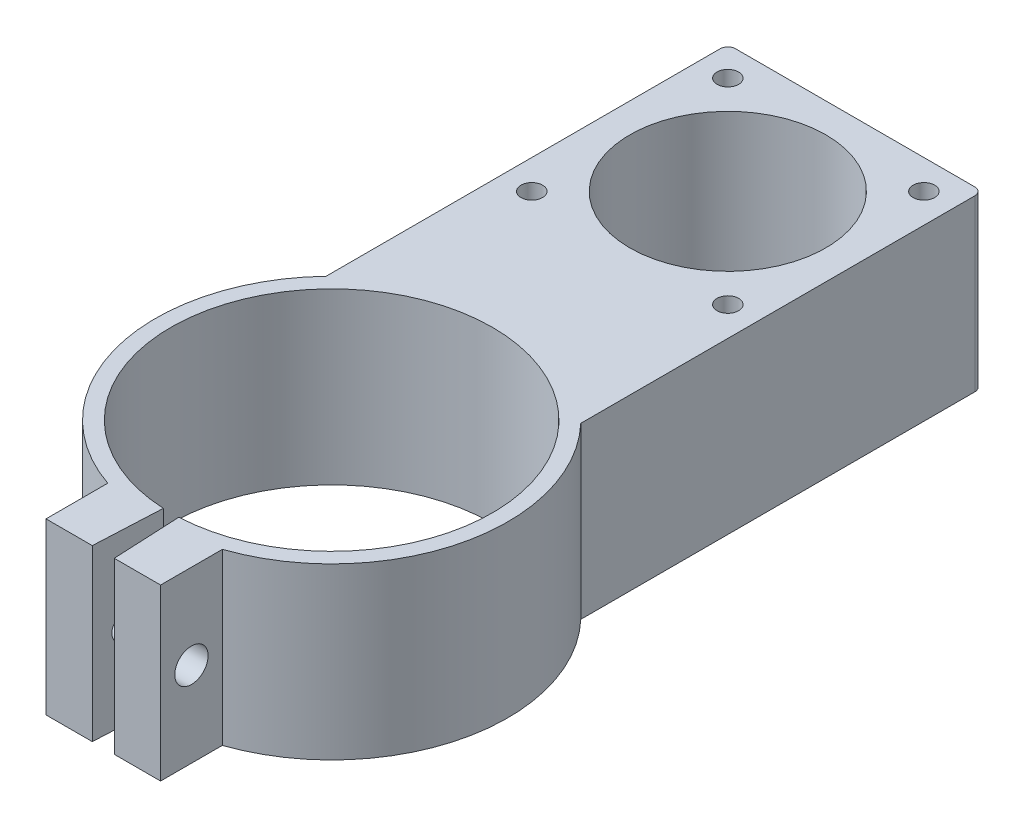
ISO-10303-21;
HEADER;
FILE_DESCRIPTION(('STEP AP214'),'2;1');
FILE_NAME('part.step','',(''),(''),'','','');
FILE_SCHEMA(('AUTOMOTIVE_DESIGN { 1 0 10303 214 1 1 1 1 }'));
ENDSEC;
DATA;
#1=APPLICATION_CONTEXT('core data for automotive mechanical design processes');
#2=APPLICATION_PROTOCOL_DEFINITION('international standard','automotive_design',2000,#1);
#3=PRODUCT_CONTEXT('',#1,'mechanical');
#4=PRODUCT('Part','Part','',(#3));
#5=PRODUCT_RELATED_PRODUCT_CATEGORY('part','',(#4));
#6=PRODUCT_DEFINITION_FORMATION('','',#4);
#7=PRODUCT_DEFINITION_CONTEXT('part definition',#1,'design');
#8=PRODUCT_DEFINITION('design','',#6,#7);
#9=PRODUCT_DEFINITION_SHAPE('','',#8);
#10=(LENGTH_UNIT() NAMED_UNIT(*) SI_UNIT(.MILLI.,.METRE.));
#11=(NAMED_UNIT(*) PLANE_ANGLE_UNIT() SI_UNIT($,.RADIAN.));
#12=(NAMED_UNIT(*) SI_UNIT($,.STERADIAN.) SOLID_ANGLE_UNIT());
#13=UNCERTAINTY_MEASURE_WITH_UNIT(LENGTH_MEASURE(1.E-05),#10,'distance_accuracy_value','');
#14=(GEOMETRIC_REPRESENTATION_CONTEXT(3) GLOBAL_UNCERTAINTY_ASSIGNED_CONTEXT((#13)) GLOBAL_UNIT_ASSIGNED_CONTEXT((#10,
#11,#12)) REPRESENTATION_CONTEXT('',''));
#15=CARTESIAN_POINT('',(0.,0.,0.));
#16=DIRECTION('',(0.,0.,1.));
#17=DIRECTION('',(1.,0.,0.));
#18=AXIS2_PLACEMENT_3D('',#15,#16,#17);
#19=CARTESIAN_POINT('',(0.,22.,0.));
#20=DIRECTION('',(0.,-1.,0.));
#21=DIRECTION('',(0.,0.,-1.));
#22=AXIS2_PLACEMENT_3D('',#19,#20,#21);
#23=CYLINDRICAL_SURFACE('',#22,20.828);
#24=CARTESIAN_POINT('',(0.,0.,0.));
#25=DIRECTION('',(0.,-1.,0.));
#26=DIRECTION('',(0.,0.,1.));
#27=AXIS2_PLACEMENT_3D('',#24,#25,#26);
#28=CIRCLE('',#27,20.828);
#29=CARTESIAN_POINT('',(-0.999999999999987,0.,20.8039800038358));
#30=VERTEX_POINT('',#29);
#31=CARTESIAN_POINT('',(1.,0.,20.8039800038358));
#32=VERTEX_POINT('',#31);
#33=EDGE_CURVE('E243',#30,#32,#28,.T.);
#34=ORIENTED_EDGE('',*,*,#33,.T.);
#35=DIRECTION('',(0.,-1.,0.));
#36=VECTOR('',#35,1.);
#37=CARTESIAN_POINT('',(1.,22.,20.8039800038358));
#38=LINE('',#37,#36);
#39=CARTESIAN_POINT('',(1.,22.,20.8039800038358));
#40=VERTEX_POINT('',#39);
#41=EDGE_CURVE('E321',#40,#32,#38,.T.);
#42=ORIENTED_EDGE('',*,*,#41,.F.);
#43=CARTESIAN_POINT('',(0.,22.,0.));
#44=DIRECTION('',(0.,-1.,0.));
#45=DIRECTION('',(0.,0.,1.));
#46=AXIS2_PLACEMENT_3D('',#43,#44,#45);
#47=CIRCLE('',#46,20.828);
#48=CARTESIAN_POINT('',(-0.999999999999987,22.,20.8039800038358));
#49=VERTEX_POINT('',#48);
#50=EDGE_CURVE('E244',#49,#40,#47,.T.);
#51=ORIENTED_EDGE('',*,*,#50,.F.);
#52=DIRECTION('',(0.,-1.,0.));
#53=VECTOR('',#52,1.);
#54=CARTESIAN_POINT('',(-0.999999999999987,22.,20.8039800038358));
#55=LINE('',#54,#53);
#56=EDGE_CURVE('E270',#49,#30,#55,.T.);
#57=ORIENTED_EDGE('',*,*,#56,.T.);
#58=EDGE_LOOP('',(#34,#42,#51,#57));
#59=FACE_BOUND('',#58,.T.);
#60=ADVANCED_FACE('F34',(#59),#23,.F.);
#61=CARTESIAN_POINT('',(1.,22.,20.8039800038358));
#62=DIRECTION('',(0.998846744950826,0.,-0.0480122911465339));
#63=DIRECTION('',(-0.0480122911465339,0.,-0.998846744950826));
#64=AXIS2_PLACEMENT_3D('',#61,#62,#63);
#65=PLANE('',#64);
#66=CARTESIAN_POINT('',(1.2299420361858,11.,25.5876895266864));
#67=DIRECTION('',(0.998846744950826,0.,-0.0480122911465339));
#68=DIRECTION('',(0.0480122911465339,0.,0.998846744950826));
#69=AXIS2_PLACEMENT_3D('',#66,#67,#68);
#70=ELLIPSE('',#69,2.16149275243049,2.159);
#71=CARTESIAN_POINT('',(1.33372025552661,11.,27.7466895266864));
#72=VERTEX_POINT('',#71);
#73=EDGE_CURVE('E232',#72,#72,#70,.F.);
#74=ORIENTED_EDGE('',*,*,#73,.F.);
#75=EDGE_LOOP('',(#74));
#76=FACE_BOUND('',#75,.T.);
#77=DIRECTION('',(0.0480122911465339,0.,0.998846744950826));
#78=VECTOR('',#77,1.);
#79=CARTESIAN_POINT('',(1.,0.,20.8039800038358));
#80=LINE('',#79,#78);
#81=CARTESIAN_POINT('',(1.42221293816044,0.,29.5876895266864));
#82=VERTEX_POINT('',#81);
#83=EDGE_CURVE('E273',#32,#82,#80,.T.);
#84=ORIENTED_EDGE('',*,*,#83,.T.);
#85=DIRECTION('',(0.,-1.,0.));
#86=VECTOR('',#85,1.);
#87=CARTESIAN_POINT('',(1.42221293816044,22.,29.5876895266864));
#88=LINE('',#87,#86);
#89=CARTESIAN_POINT('',(1.42221293816044,22.,29.5876895266864));
#90=VERTEX_POINT('',#89);
#91=EDGE_CURVE('E318',#90,#82,#88,.T.);
#92=ORIENTED_EDGE('',*,*,#91,.F.);
#93=DIRECTION('',(0.0480122911465339,0.,0.998846744950826));
#94=VECTOR('',#93,1.);
#95=CARTESIAN_POINT('',(1.,22.,20.8039800038358));
#96=LINE('',#95,#94);
#97=EDGE_CURVE('E247',#40,#90,#96,.T.);
#98=ORIENTED_EDGE('',*,*,#97,.F.);
#99=ORIENTED_EDGE('',*,*,#41,.T.);
#100=EDGE_LOOP('',(#84,#92,#98,#99));
#101=FACE_BOUND('',#100,.T.);
#102=ADVANCED_FACE('F365',(#76,#101),#65,.F.);
#103=CARTESIAN_POINT('',(1.42221293816044,22.,29.5876895266864));
#104=DIRECTION('',(0.,0.,-1.));
#105=DIRECTION('',(-1.,0.,0.));
#106=AXIS2_PLACEMENT_3D('',#103,#104,#105);
#107=PLANE('',#106);
#108=DIRECTION('',(1.,0.,0.));
#109=VECTOR('',#108,1.);
#110=CARTESIAN_POINT('',(1.42221293816044,0.,29.5876895266864));
#111=LINE('',#110,#109);
#112=CARTESIAN_POINT('',(7.42221293816044,0.,29.5876895266864));
#113=VERTEX_POINT('',#112);
#114=EDGE_CURVE('E275',#82,#113,#111,.T.);
#115=ORIENTED_EDGE('',*,*,#114,.T.);
#116=DIRECTION('',(0.,-1.,0.));
#117=VECTOR('',#116,1.);
#118=CARTESIAN_POINT('',(7.42221293816044,22.,29.5876895266864));
#119=LINE('',#118,#117);
#120=CARTESIAN_POINT('',(7.42221293816044,22.,29.5876895266864));
#121=VERTEX_POINT('',#120);
#122=EDGE_CURVE('E315',#121,#113,#119,.T.);
#123=ORIENTED_EDGE('',*,*,#122,.F.);
#124=DIRECTION('',(1.,0.,0.));
#125=VECTOR('',#124,1.);
#126=CARTESIAN_POINT('',(1.42221293816044,22.,29.5876895266864));
#127=LINE('',#126,#125);
#128=EDGE_CURVE('E250',#90,#121,#127,.T.);
#129=ORIENTED_EDGE('',*,*,#128,.F.);
#130=ORIENTED_EDGE('',*,*,#91,.T.);
#131=EDGE_LOOP('',(#115,#123,#129,#130));
#132=FACE_BOUND('',#131,.T.);
#133=ADVANCED_FACE('F362',(#132),#107,.F.);
#134=CARTESIAN_POINT('',(7.42221293816044,22.,29.5876895266864));
#135=DIRECTION('',(-1.,0.,0.));
#136=DIRECTION('',(0.,0.,1.));
#137=AXIS2_PLACEMENT_3D('',#134,#135,#136);
#138=PLANE('',#137);
#139=CARTESIAN_POINT('',(7.42221293816044,11.,25.5876895266864));
#140=DIRECTION('',(1.,0.,0.));
#141=DIRECTION('',(0.,0.,-1.));
#142=AXIS2_PLACEMENT_3D('',#139,#140,#141);
#143=CIRCLE('',#142,2.159);
#144=CARTESIAN_POINT('',(7.42221293816044,11.,23.4286895266863));
#145=VERTEX_POINT('',#144);
#146=EDGE_CURVE('E229',#145,#145,#143,.T.);
#147=ORIENTED_EDGE('',*,*,#146,.F.);
#148=EDGE_LOOP('',(#147));
#149=FACE_BOUND('',#148,.T.);
#150=DIRECTION('',(0.,0.,-1.));
#151=VECTOR('',#150,1.);
#152=CARTESIAN_POINT('',(7.42221293816044,0.,29.5876895266864));
#153=LINE('',#152,#151);
#154=CARTESIAN_POINT('',(7.42221293816044,0.,21.5876895266864));
#155=VERTEX_POINT('',#154);
#156=EDGE_CURVE('E277',#113,#155,#153,.T.);
#157=ORIENTED_EDGE('',*,*,#156,.T.);
#158=DIRECTION('',(0.,-1.,0.));
#159=VECTOR('',#158,1.);
#160=CARTESIAN_POINT('',(7.42221293816044,22.,21.5876895266864));
#161=LINE('',#160,#159);
#162=CARTESIAN_POINT('',(7.42221293816044,22.,21.5876895266864));
#163=VERTEX_POINT('',#162);
#164=EDGE_CURVE('E312',#163,#155,#161,.T.);
#165=ORIENTED_EDGE('',*,*,#164,.F.);
#166=DIRECTION('',(0.,0.,-1.));
#167=VECTOR('',#166,1.);
#168=CARTESIAN_POINT('',(7.42221293816044,22.,29.5876895266864));
#169=LINE('',#168,#167);
#170=EDGE_CURVE('E252',#121,#163,#169,.T.);
#171=ORIENTED_EDGE('',*,*,#170,.F.);
#172=ORIENTED_EDGE('',*,*,#122,.T.);
#173=EDGE_LOOP('',(#157,#165,#171,#172));
#174=FACE_BOUND('',#173,.T.);
#175=ADVANCED_FACE('F357',(#149,#174),#138,.F.);
#176=CARTESIAN_POINT('',(0.,22.,0.));
#177=DIRECTION('',(0.,-1.,0.));
#178=DIRECTION('',(0.,0.,-1.));
#179=AXIS2_PLACEMENT_3D('',#176,#177,#178);
#180=CYLINDRICAL_SURFACE('',#179,22.828);
#181=CARTESIAN_POINT('',(0.,0.,0.));
#182=DIRECTION('',(0.,1.,0.));
#183=DIRECTION('',(0.,0.,1.));
#184=AXIS2_PLACEMENT_3D('',#181,#182,#183);
#185=CIRCLE('',#184,22.828);
#186=CARTESIAN_POINT('',(16.5,0.,-15.775537518576));
#187=VERTEX_POINT('',#186);
#188=EDGE_CURVE('E279',#155,#187,#185,.T.);
#189=ORIENTED_EDGE('',*,*,#188,.T.);
#190=DIRECTION('',(0.,-1.,0.));
#191=VECTOR('',#190,1.);
#192=CARTESIAN_POINT('',(16.5,22.,-15.775537518576));
#193=LINE('',#192,#191);
#194=CARTESIAN_POINT('',(16.5,22.,-15.775537518576));
#195=VERTEX_POINT('',#194);
#196=EDGE_CURVE('E309',#195,#187,#193,.T.);
#197=ORIENTED_EDGE('',*,*,#196,.F.);
#198=CARTESIAN_POINT('',(0.,22.,0.));
#199=DIRECTION('',(0.,1.,0.));
#200=DIRECTION('',(0.,0.,1.));
#201=AXIS2_PLACEMENT_3D('',#198,#199,#200);
#202=CIRCLE('',#201,22.828);
#203=EDGE_CURVE('E254',#163,#195,#202,.T.);
#204=ORIENTED_EDGE('',*,*,#203,.F.);
#205=ORIENTED_EDGE('',*,*,#164,.T.);
#206=EDGE_LOOP('',(#189,#197,#204,#205));
#207=FACE_BOUND('',#206,.T.);
#208=ADVANCED_FACE('F352',(#207),#180,.T.);
#209=CARTESIAN_POINT('',(16.5,22.,-67.828));
#210=DIRECTION('',(-1.,0.,0.));
#211=DIRECTION('',(0.,0.,1.));
#212=AXIS2_PLACEMENT_3D('',#209,#210,#211);
#213=PLANE('',#212);
#214=DIRECTION('',(0.,0.,-1.));
#215=VECTOR('',#214,1.);
#216=CARTESIAN_POINT('',(16.5,0.,-67.828));
#217=LINE('',#216,#215);
#218=CARTESIAN_POINT('',(16.5,0.,-66.828));
#219=VERTEX_POINT('',#218);
#220=EDGE_CURVE('E281',#187,#219,#217,.T.);
#221=ORIENTED_EDGE('',*,*,#220,.T.);
#222=DIRECTION('',(0.,-1.,0.));
#223=VECTOR('',#222,1.);
#224=CARTESIAN_POINT('',(16.5,22.,-66.828));
#225=LINE('',#224,#223);
#226=CARTESIAN_POINT('',(16.5,22.,-66.828));
#227=VERTEX_POINT('',#226);
#228=EDGE_CURVE('E57',#219,#227,#225,.F.);
#229=ORIENTED_EDGE('',*,*,#228,.T.);
#230=DIRECTION('',(0.,0.,-1.));
#231=VECTOR('',#230,1.);
#232=CARTESIAN_POINT('',(16.5,22.,-67.828));
#233=LINE('',#232,#231);
#234=EDGE_CURVE('E256',#195,#227,#233,.T.);
#235=ORIENTED_EDGE('',*,*,#234,.F.);
#236=ORIENTED_EDGE('',*,*,#196,.T.);
#237=EDGE_LOOP('',(#221,#229,#235,#236));
#238=FACE_BOUND('',#237,.T.);
#239=ADVANCED_FACE('F348',(#238),#213,.F.);
#240=CARTESIAN_POINT('',(-16.5,22.,-67.828));
#241=DIRECTION('',(0.,0.,1.));
#242=DIRECTION('',(1.,0.,0.));
#243=AXIS2_PLACEMENT_3D('',#240,#241,#242);
#244=PLANE('',#243);
#245=DIRECTION('',(-1.,0.,0.));
#246=VECTOR('',#245,1.);
#247=CARTESIAN_POINT('',(-16.5,22.,-67.828));
#248=LINE('',#247,#246);
#249=CARTESIAN_POINT('',(15.5,22.,-67.828));
#250=VERTEX_POINT('',#249);
#251=CARTESIAN_POINT('',(-15.5,22.,-67.828));
#252=VERTEX_POINT('',#251);
#253=EDGE_CURVE('E258',#250,#252,#248,.T.);
#254=ORIENTED_EDGE('',*,*,#253,.F.);
#255=DIRECTION('',(0.,-1.,0.));
#256=VECTOR('',#255,1.);
#257=CARTESIAN_POINT('',(15.5,22.,-67.828));
#258=LINE('',#257,#256);
#259=CARTESIAN_POINT('',(15.5,0.,-67.828));
#260=VERTEX_POINT('',#259);
#261=EDGE_CURVE('E326',#250,#260,#258,.T.);
#262=ORIENTED_EDGE('',*,*,#261,.T.);
#263=DIRECTION('',(-1.,0.,0.));
#264=VECTOR('',#263,1.);
#265=CARTESIAN_POINT('',(-16.5,0.,-67.828));
#266=LINE('',#265,#264);
#267=CARTESIAN_POINT('',(-15.5,0.,-67.828));
#268=VERTEX_POINT('',#267);
#269=EDGE_CURVE('E283',#260,#268,#266,.T.);
#270=ORIENTED_EDGE('',*,*,#269,.T.);
#271=DIRECTION('',(0.,-1.,0.));
#272=VECTOR('',#271,1.);
#273=CARTESIAN_POINT('',(-15.5,22.,-67.828));
#274=LINE('',#273,#272);
#275=EDGE_CURVE('E324',#268,#252,#274,.F.);
#276=ORIENTED_EDGE('',*,*,#275,.T.);
#277=EDGE_LOOP('',(#254,#262,#270,#276));
#278=FACE_BOUND('',#277,.T.);
#279=ADVANCED_FACE('F340',(#278),#244,.F.);
#280=CARTESIAN_POINT('',(-16.5,22.,-67.828));
#281=DIRECTION('',(1.,0.,0.));
#282=DIRECTION('',(0.,0.,-1.));
#283=AXIS2_PLACEMENT_3D('',#280,#281,#282);
#284=PLANE('',#283);
#285=DIRECTION('',(0.,0.,1.));
#286=VECTOR('',#285,1.);
#287=CARTESIAN_POINT('',(-16.5,22.,-67.828));
#288=LINE('',#287,#286);
#289=CARTESIAN_POINT('',(-16.5,22.,-66.828));
#290=VERTEX_POINT('',#289);
#291=CARTESIAN_POINT('',(-16.5,22.,-15.775537518576));
#292=VERTEX_POINT('',#291);
#293=EDGE_CURVE('E260',#290,#292,#288,.T.);
#294=ORIENTED_EDGE('',*,*,#293,.F.);
#295=DIRECTION('',(0.,-1.,0.));
#296=VECTOR('',#295,1.);
#297=CARTESIAN_POINT('',(-16.5,22.,-66.828));
#298=LINE('',#297,#296);
#299=CARTESIAN_POINT('',(-16.5,0.,-66.828));
#300=VERTEX_POINT('',#299);
#301=EDGE_CURVE('E12',#290,#300,#298,.T.);
#302=ORIENTED_EDGE('',*,*,#301,.T.);
#303=DIRECTION('',(0.,0.,1.));
#304=VECTOR('',#303,1.);
#305=CARTESIAN_POINT('',(-16.5,0.,-67.828));
#306=LINE('',#305,#304);
#307=CARTESIAN_POINT('',(-16.5,0.,-15.775537518576));
#308=VERTEX_POINT('',#307);
#309=EDGE_CURVE('E286',#300,#308,#306,.T.);
#310=ORIENTED_EDGE('',*,*,#309,.T.);
#311=DIRECTION('',(0.,-1.,0.));
#312=VECTOR('',#311,1.);
#313=CARTESIAN_POINT('',(-16.5,22.,-15.775537518576));
#314=LINE('',#313,#312);
#315=EDGE_CURVE('E306',#292,#308,#314,.T.);
#316=ORIENTED_EDGE('',*,*,#315,.F.);
#317=EDGE_LOOP('',(#294,#302,#310,#316));
#318=FACE_BOUND('',#317,.T.);
#319=ADVANCED_FACE('F393',(#318),#284,.F.);
#320=CARTESIAN_POINT('',(0.,22.,0.));
#321=DIRECTION('',(0.,-1.,0.));
#322=DIRECTION('',(0.,0.,-1.));
#323=AXIS2_PLACEMENT_3D('',#320,#321,#322);
#324=CYLINDRICAL_SURFACE('',#323,22.828);
#325=CARTESIAN_POINT('',(0.,0.,0.));
#326=DIRECTION('',(0.,1.,0.));
#327=DIRECTION('',(0.,0.,1.));
#328=AXIS2_PLACEMENT_3D('',#325,#326,#327);
#329=CIRCLE('',#328,22.828);
#330=CARTESIAN_POINT('',(-7.42221293816044,0.,21.5876895266864));
#331=VERTEX_POINT('',#330);
#332=EDGE_CURVE('E288',#308,#331,#329,.T.);
#333=ORIENTED_EDGE('',*,*,#332,.T.);
#334=DIRECTION('',(0.,-1.,0.));
#335=VECTOR('',#334,1.);
#336=CARTESIAN_POINT('',(-7.42221293816044,22.,21.5876895266864));
#337=LINE('',#336,#335);
#338=CARTESIAN_POINT('',(-7.42221293816044,22.,21.5876895266864));
#339=VERTEX_POINT('',#338);
#340=EDGE_CURVE('E303',#339,#331,#337,.T.);
#341=ORIENTED_EDGE('',*,*,#340,.F.);
#342=CARTESIAN_POINT('',(0.,22.,0.));
#343=DIRECTION('',(0.,1.,0.));
#344=DIRECTION('',(0.,0.,1.));
#345=AXIS2_PLACEMENT_3D('',#342,#343,#344);
#346=CIRCLE('',#345,22.828);
#347=EDGE_CURVE('E262',#292,#339,#346,.T.);
#348=ORIENTED_EDGE('',*,*,#347,.F.);
#349=ORIENTED_EDGE('',*,*,#315,.T.);
#350=EDGE_LOOP('',(#333,#341,#348,#349));
#351=FACE_BOUND('',#350,.T.);
#352=ADVANCED_FACE('F390',(#351),#324,.T.);
#353=CARTESIAN_POINT('',(-7.42221293816043,22.,29.5876895266864));
#354=DIRECTION('',(1.,0.,0.));
#355=DIRECTION('',(0.,0.,-1.));
#356=AXIS2_PLACEMENT_3D('',#353,#354,#355);
#357=PLANE('',#356);
#358=CARTESIAN_POINT('',(-7.42221293816042,11.,25.5876895266864));
#359=DIRECTION('',(-1.,0.,0.));
#360=DIRECTION('',(0.,0.,1.));
#361=AXIS2_PLACEMENT_3D('',#358,#359,#360);
#362=CIRCLE('',#361,1.5875);
#363=CARTESIAN_POINT('',(-7.42221293816042,11.,27.1751895266864));
#364=VERTEX_POINT('',#363);
#365=EDGE_CURVE('E240',#364,#364,#362,.T.);
#366=ORIENTED_EDGE('',*,*,#365,.F.);
#367=EDGE_LOOP('',(#366));
#368=FACE_BOUND('',#367,.T.);
#369=DIRECTION('',(0.,0.,1.));
#370=VECTOR('',#369,1.);
#371=CARTESIAN_POINT('',(-7.42221293816043,0.,29.5876895266864));
#372=LINE('',#371,#370);
#373=CARTESIAN_POINT('',(-7.42221293816043,0.,29.5876895266864));
#374=VERTEX_POINT('',#373);
#375=EDGE_CURVE('E290',#331,#374,#372,.T.);
#376=ORIENTED_EDGE('',*,*,#375,.T.);
#377=DIRECTION('',(0.,-1.,0.));
#378=VECTOR('',#377,1.);
#379=CARTESIAN_POINT('',(-7.42221293816043,22.,29.5876895266864));
#380=LINE('',#379,#378);
#381=CARTESIAN_POINT('',(-7.42221293816043,22.,29.5876895266864));
#382=VERTEX_POINT('',#381);
#383=EDGE_CURVE('E300',#382,#374,#380,.T.);
#384=ORIENTED_EDGE('',*,*,#383,.F.);
#385=DIRECTION('',(0.,0.,1.));
#386=VECTOR('',#385,1.);
#387=CARTESIAN_POINT('',(-7.42221293816043,22.,29.5876895266864));
#388=LINE('',#387,#386);
#389=EDGE_CURVE('E264',#339,#382,#388,.T.);
#390=ORIENTED_EDGE('',*,*,#389,.F.);
#391=ORIENTED_EDGE('',*,*,#340,.T.);
#392=EDGE_LOOP('',(#376,#384,#390,#391));
#393=FACE_BOUND('',#392,.T.);
#394=ADVANCED_FACE('F385',(#368,#393),#357,.F.);
#395=CARTESIAN_POINT('',(-1.42221293816043,22.,29.5876895266864));
#396=DIRECTION('',(0.,0.,-1.));
#397=DIRECTION('',(-1.,0.,0.));
#398=AXIS2_PLACEMENT_3D('',#395,#396,#397);
#399=PLANE('',#398);
#400=DIRECTION('',(1.,0.,0.));
#401=VECTOR('',#400,1.);
#402=CARTESIAN_POINT('',(-1.42221293816043,0.,29.5876895266864));
#403=LINE('',#402,#401);
#404=CARTESIAN_POINT('',(-1.42221293816043,0.,29.5876895266864));
#405=VERTEX_POINT('',#404);
#406=EDGE_CURVE('E292',#374,#405,#403,.T.);
#407=ORIENTED_EDGE('',*,*,#406,.T.);
#408=DIRECTION('',(0.,-1.,0.));
#409=VECTOR('',#408,1.);
#410=CARTESIAN_POINT('',(-1.42221293816043,22.,29.5876895266864));
#411=LINE('',#410,#409);
#412=CARTESIAN_POINT('',(-1.42221293816043,22.,29.5876895266864));
#413=VERTEX_POINT('',#412);
#414=EDGE_CURVE('E297',#413,#405,#411,.T.);
#415=ORIENTED_EDGE('',*,*,#414,.F.);
#416=DIRECTION('',(1.,0.,0.));
#417=VECTOR('',#416,1.);
#418=CARTESIAN_POINT('',(-1.42221293816043,22.,29.5876895266864));
#419=LINE('',#418,#417);
#420=EDGE_CURVE('E266',#382,#413,#419,.T.);
#421=ORIENTED_EDGE('',*,*,#420,.F.);
#422=ORIENTED_EDGE('',*,*,#383,.T.);
#423=EDGE_LOOP('',(#407,#415,#421,#422));
#424=FACE_BOUND('',#423,.T.);
#425=ADVANCED_FACE('F379',(#424),#399,.F.);
#426=CARTESIAN_POINT('',(-0.999999999999987,22.,20.8039800038358));
#427=DIRECTION('',(-0.998846744950826,0.,-0.0480122911465337));
#428=DIRECTION('',(-0.0480122911465337,0.,0.998846744950826));
#429=AXIS2_PLACEMENT_3D('',#426,#427,#428);
#430=PLANE('',#429);
#431=CARTESIAN_POINT('',(-1.22994203618578,11.,25.5876895266864));
#432=DIRECTION('',(-0.998846744950826,0.,-0.0480122911465337));
#433=DIRECTION('',(-0.0480122911465337,0.,0.998846744950826));
#434=AXIS2_PLACEMENT_3D('',#431,#432,#433);
#435=ELLIPSE('',#434,1.58933290619889,1.5875);
#436=CARTESIAN_POINT('',(-1.30624955040697,11.,27.1751895266864));
#437=VERTEX_POINT('',#436);
#438=EDGE_CURVE('E235',#437,#437,#435,.F.);
#439=ORIENTED_EDGE('',*,*,#438,.F.);
#440=EDGE_LOOP('',(#439));
#441=FACE_BOUND('',#440,.T.);
#442=DIRECTION('',(0.0480122911465337,0.,-0.998846744950826));
#443=VECTOR('',#442,1.);
#444=CARTESIAN_POINT('',(-0.999999999999987,0.,20.8039800038358));
#445=LINE('',#444,#443);
#446=EDGE_CURVE('E248',#405,#30,#445,.T.);
#447=ORIENTED_EDGE('',*,*,#446,.T.);
#448=ORIENTED_EDGE('',*,*,#56,.F.);
#449=DIRECTION('',(0.0480122911465337,0.,-0.998846744950826));
#450=VECTOR('',#449,1.);
#451=CARTESIAN_POINT('',(-0.999999999999987,22.,20.8039800038358));
#452=LINE('',#451,#450);
#453=EDGE_CURVE('E268',#413,#49,#452,.T.);
#454=ORIENTED_EDGE('',*,*,#453,.F.);
#455=ORIENTED_EDGE('',*,*,#414,.T.);
#456=EDGE_LOOP('',(#447,#448,#454,#455));
#457=FACE_BOUND('',#456,.T.);
#458=ADVANCED_FACE('F375',(#441,#457),#430,.F.);
#459=CARTESIAN_POINT('',(0.,22.,0.));
#460=DIRECTION('',(0.,1.,0.));
#461=DIRECTION('',(0.,0.,1.));
#462=AXIS2_PLACEMENT_3D('',#459,#460,#461);
#463=PLANE('',#462);
#464=CARTESIAN_POINT('',(-12.6999999999999,22.,-64.0280000000001));
#465=DIRECTION('',(0.,1.,0.));
#466=DIRECTION('',(0.,0.,1.));
#467=AXIS2_PLACEMENT_3D('',#464,#465,#466);
#468=CIRCLE('',#467,1.397);
#469=CARTESIAN_POINT('',(-12.6999999999999,22.,-62.6310000000001));
#470=VERTEX_POINT('',#469);
#471=EDGE_CURVE('E201',#470,#470,#468,.T.);
#472=ORIENTED_EDGE('',*,*,#471,.F.);
#473=EDGE_LOOP('',(#472));
#474=FACE_BOUND('',#473,.T.);
#475=CARTESIAN_POINT('',(-12.7000000000001,22.,-38.6280000000001));
#476=DIRECTION('',(0.,1.,0.));
#477=DIRECTION('',(0.,0.,1.));
#478=AXIS2_PLACEMENT_3D('',#475,#476,#477);
#479=CIRCLE('',#478,1.397);
#480=CARTESIAN_POINT('',(-12.7000000000001,22.,-37.2310000000001));
#481=VERTEX_POINT('',#480);
#482=EDGE_CURVE('E212',#481,#481,#479,.T.);
#483=ORIENTED_EDGE('',*,*,#482,.F.);
#484=EDGE_LOOP('',(#483));
#485=FACE_BOUND('',#484,.T.);
#486=CARTESIAN_POINT('',(12.7,22.,-38.628));
#487=DIRECTION('',(0.,1.,0.));
#488=DIRECTION('',(0.,0.,1.));
#489=AXIS2_PLACEMENT_3D('',#486,#487,#488);
#490=CIRCLE('',#489,1.397);
#491=CARTESIAN_POINT('',(12.7,22.,-37.231));
#492=VERTEX_POINT('',#491);
#493=EDGE_CURVE('E206',#492,#492,#490,.T.);
#494=ORIENTED_EDGE('',*,*,#493,.F.);
#495=EDGE_LOOP('',(#494));
#496=FACE_BOUND('',#495,.T.);
#497=CARTESIAN_POINT('',(12.7,22.,-64.028));
#498=DIRECTION('',(0.,1.,0.));
#499=DIRECTION('',(0.,0.,1.));
#500=AXIS2_PLACEMENT_3D('',#497,#498,#499);
#501=CIRCLE('',#500,1.397);
#502=CARTESIAN_POINT('',(12.7,22.,-62.631));
#503=VERTEX_POINT('',#502);
#504=EDGE_CURVE('E205',#503,#503,#501,.T.);
#505=ORIENTED_EDGE('',*,*,#504,.F.);
#506=EDGE_LOOP('',(#505));
#507=FACE_BOUND('',#506,.T.);
#508=CARTESIAN_POINT('',(0.,22.,-51.328));
#509=DIRECTION('',(0.,-1.,0.));
#510=DIRECTION('',(0.,0.,-1.));
#511=AXIS2_PLACEMENT_3D('',#508,#509,#510);
#512=CIRCLE('',#511,12.7);
#513=CARTESIAN_POINT('',(0.,22.,-64.028));
#514=VERTEX_POINT('',#513);
#515=EDGE_CURVE('E226',#514,#514,#512,.T.);
#516=ORIENTED_EDGE('',*,*,#515,.T.);
#517=EDGE_LOOP('',(#516));
#518=FACE_BOUND('',#517,.T.);
#519=ORIENTED_EDGE('',*,*,#234,.T.);
#520=CARTESIAN_POINT('',(15.5,22.,-66.828));
#521=DIRECTION('',(0.,1.,0.));
#522=DIRECTION('',(0.,0.,1.));
#523=AXIS2_PLACEMENT_3D('',#520,#521,#522);
#524=CIRCLE('',#523,1.);
#525=EDGE_CURVE('E42',#227,#250,#524,.T.);
#526=ORIENTED_EDGE('',*,*,#525,.T.);
#527=ORIENTED_EDGE('',*,*,#253,.T.);
#528=CARTESIAN_POINT('',(-15.5,22.,-66.828));
#529=DIRECTION('',(0.,1.,0.));
#530=DIRECTION('',(0.,0.,1.));
#531=AXIS2_PLACEMENT_3D('',#528,#529,#530);
#532=CIRCLE('',#531,1.);
#533=EDGE_CURVE('E49',#252,#290,#532,.T.);
#534=ORIENTED_EDGE('',*,*,#533,.T.);
#535=ORIENTED_EDGE('',*,*,#293,.T.);
#536=ORIENTED_EDGE('',*,*,#347,.T.);
#537=ORIENTED_EDGE('',*,*,#389,.T.);
#538=ORIENTED_EDGE('',*,*,#420,.T.);
#539=ORIENTED_EDGE('',*,*,#453,.T.);
#540=ORIENTED_EDGE('',*,*,#50,.T.);
#541=ORIENTED_EDGE('',*,*,#97,.T.);
#542=ORIENTED_EDGE('',*,*,#128,.T.);
#543=ORIENTED_EDGE('',*,*,#170,.T.);
#544=ORIENTED_EDGE('',*,*,#203,.T.);
#545=EDGE_LOOP('',(#519,#526,#527,#534,#535,#536,#537,#538,#539,#540,#541,#542,#543,#544));
#546=FACE_BOUND('',#545,.T.);
#547=ADVANCED_FACE('F336',(#474,#485,#496,#507,#518,#546),#463,.T.);
#548=CARTESIAN_POINT('',(0.,0.,0.));
#549=DIRECTION('',(0.,1.,0.));
#550=DIRECTION('',(0.,0.,1.));
#551=AXIS2_PLACEMENT_3D('',#548,#549,#550);
#552=PLANE('',#551);
#553=DIRECTION('',(0.,0.,1.));
#554=VECTOR('',#553,1.);
#555=CARTESIAN_POINT('',(13.5,0.,-34.628));
#556=LINE('',#555,#554);
#557=CARTESIAN_POINT('',(13.5,0.,-34.628));
#558=VERTEX_POINT('',#557);
#559=CARTESIAN_POINT('',(13.5,0.,-19.6347544929902));
#560=VERTEX_POINT('',#559);
#561=EDGE_CURVE('E186',#558,#560,#556,.T.);
#562=ORIENTED_EDGE('',*,*,#561,.F.);
#563=DIRECTION('',(1.,0.,0.));
#564=VECTOR('',#563,1.);
#565=CARTESIAN_POINT('',(-13.5,0.,-34.628));
#566=LINE('',#565,#564);
#567=CARTESIAN_POINT('',(-13.5,0.,-34.628));
#568=VERTEX_POINT('',#567);
#569=EDGE_CURVE('E178',#568,#558,#566,.T.);
#570=ORIENTED_EDGE('',*,*,#569,.F.);
#571=DIRECTION('',(0.,0.,-1.));
#572=VECTOR('',#571,1.);
#573=CARTESIAN_POINT('',(-13.5,0.,-34.628));
#574=LINE('',#573,#572);
#575=CARTESIAN_POINT('',(-13.5,0.,-19.6347544929902));
#576=VERTEX_POINT('',#575);
#577=EDGE_CURVE('E190',#576,#568,#574,.T.);
#578=ORIENTED_EDGE('',*,*,#577,.F.);
#579=CARTESIAN_POINT('',(0.,0.,0.));
#580=DIRECTION('',(0.,1.,0.));
#581=DIRECTION('',(0.,0.,-1.));
#582=AXIS2_PLACEMENT_3D('',#579,#580,#581);
#583=CIRCLE('',#582,23.828);
#584=EDGE_CURVE('E184',#560,#576,#583,.T.);
#585=ORIENTED_EDGE('',*,*,#584,.F.);
#586=EDGE_LOOP('',(#562,#570,#578,#585));
#587=FACE_BOUND('',#586,.T.);
#588=CARTESIAN_POINT('',(-12.6999999999999,0.,-64.0280000000001));
#589=DIRECTION('',(0.,1.,0.));
#590=DIRECTION('',(0.,0.,1.));
#591=AXIS2_PLACEMENT_3D('',#588,#589,#590);
#592=CIRCLE('',#591,1.397);
#593=CARTESIAN_POINT('',(-12.6999999999999,0.,-62.6310000000001));
#594=VERTEX_POINT('',#593);
#595=EDGE_CURVE('E215',#594,#594,#592,.T.);
#596=ORIENTED_EDGE('',*,*,#595,.T.);
#597=EDGE_LOOP('',(#596));
#598=FACE_BOUND('',#597,.T.);
#599=CARTESIAN_POINT('',(-12.7000000000001,0.,-38.6280000000001));
#600=DIRECTION('',(0.,1.,0.));
#601=DIRECTION('',(0.,0.,1.));
#602=AXIS2_PLACEMENT_3D('',#599,#600,#601);
#603=CIRCLE('',#602,1.397);
#604=CARTESIAN_POINT('',(-12.7000000000001,0.,-37.2310000000001));
#605=VERTEX_POINT('',#604);
#606=EDGE_CURVE('E209',#605,#605,#603,.T.);
#607=ORIENTED_EDGE('',*,*,#606,.T.);
#608=EDGE_LOOP('',(#607));
#609=FACE_BOUND('',#608,.T.);
#610=CARTESIAN_POINT('',(12.7,0.,-38.628));
#611=DIRECTION('',(0.,1.,0.));
#612=DIRECTION('',(0.,0.,1.));
#613=AXIS2_PLACEMENT_3D('',#610,#611,#612);
#614=CIRCLE('',#613,1.397);
#615=CARTESIAN_POINT('',(12.7,0.,-37.231));
#616=VERTEX_POINT('',#615);
#617=EDGE_CURVE('E202',#616,#616,#614,.T.);
#618=ORIENTED_EDGE('',*,*,#617,.T.);
#619=EDGE_LOOP('',(#618));
#620=FACE_BOUND('',#619,.T.);
#621=CARTESIAN_POINT('',(12.7,0.,-64.028));
#622=DIRECTION('',(0.,1.,0.));
#623=DIRECTION('',(0.,0.,1.));
#624=AXIS2_PLACEMENT_3D('',#621,#622,#623);
#625=CIRCLE('',#624,1.397);
#626=CARTESIAN_POINT('',(12.7,0.,-62.631));
#627=VERTEX_POINT('',#626);
#628=EDGE_CURVE('E220',#627,#627,#625,.T.);
#629=ORIENTED_EDGE('',*,*,#628,.T.);
#630=EDGE_LOOP('',(#629));
#631=FACE_BOUND('',#630,.T.);
#632=CARTESIAN_POINT('',(0.,0.,-51.328));
#633=DIRECTION('',(0.,-1.,0.));
#634=DIRECTION('',(0.,0.,-1.));
#635=AXIS2_PLACEMENT_3D('',#632,#633,#634);
#636=CIRCLE('',#635,12.7);
#637=CARTESIAN_POINT('',(0.,0.,-64.028));
#638=VERTEX_POINT('',#637);
#639=EDGE_CURVE('E223',#638,#638,#636,.T.);
#640=ORIENTED_EDGE('',*,*,#639,.F.);
#641=EDGE_LOOP('',(#640));
#642=FACE_BOUND('',#641,.T.);
#643=ORIENTED_EDGE('',*,*,#269,.F.);
#644=CARTESIAN_POINT('',(15.5,0.,-66.828));
#645=DIRECTION('',(0.,1.,0.));
#646=DIRECTION('',(0.,0.,1.));
#647=AXIS2_PLACEMENT_3D('',#644,#645,#646);
#648=CIRCLE('',#647,1.);
#649=EDGE_CURVE('E331',#260,#219,#648,.F.);
#650=ORIENTED_EDGE('',*,*,#649,.T.);
#651=ORIENTED_EDGE('',*,*,#220,.F.);
#652=ORIENTED_EDGE('',*,*,#188,.F.);
#653=ORIENTED_EDGE('',*,*,#156,.F.);
#654=ORIENTED_EDGE('',*,*,#114,.F.);
#655=ORIENTED_EDGE('',*,*,#83,.F.);
#656=ORIENTED_EDGE('',*,*,#33,.F.);
#657=ORIENTED_EDGE('',*,*,#446,.F.);
#658=ORIENTED_EDGE('',*,*,#406,.F.);
#659=ORIENTED_EDGE('',*,*,#375,.F.);
#660=ORIENTED_EDGE('',*,*,#332,.F.);
#661=ORIENTED_EDGE('',*,*,#309,.F.);
#662=CARTESIAN_POINT('',(-15.5,0.,-66.828));
#663=DIRECTION('',(0.,1.,0.));
#664=DIRECTION('',(0.,0.,1.));
#665=AXIS2_PLACEMENT_3D('',#662,#663,#664);
#666=CIRCLE('',#665,1.);
#667=EDGE_CURVE('E329',#300,#268,#666,.F.);
#668=ORIENTED_EDGE('',*,*,#667,.T.);
#669=EDGE_LOOP('',(#643,#650,#651,#652,#653,#654,#655,#656,#657,#658,#659,#660,#661,#668));
#670=FACE_BOUND('',#669,.T.);
#671=ADVANCED_FACE('F346',(#587,#598,#609,#620,#631,#642,#670),#552,.F.);
#672=CARTESIAN_POINT('',(22.8290000000001,11.,25.5876895266863));
#673=DIRECTION('',(-1.,0.,0.));
#674=DIRECTION('',(0.,0.,1.));
#675=AXIS2_PLACEMENT_3D('',#672,#673,#674);
#676=CYLINDRICAL_SURFACE('',#675,1.5875);
#677=ORIENTED_EDGE('',*,*,#365,.T.);
#678=EDGE_LOOP('',(#677));
#679=FACE_BOUND('',#678,.T.);
#680=ORIENTED_EDGE('',*,*,#438,.T.);
#681=EDGE_LOOP('',(#680));
#682=FACE_BOUND('',#681,.T.);
#683=ADVANCED_FACE('F434',(#679,#682),#676,.F.);
#684=CARTESIAN_POINT('',(-22.829,11.,25.5876895266864));
#685=DIRECTION('',(1.,0.,0.));
#686=DIRECTION('',(0.,0.,-1.));
#687=AXIS2_PLACEMENT_3D('',#684,#685,#686);
#688=CYLINDRICAL_SURFACE('',#687,2.159);
#689=ORIENTED_EDGE('',*,*,#146,.T.);
#690=EDGE_LOOP('',(#689));
#691=FACE_BOUND('',#690,.T.);
#692=ORIENTED_EDGE('',*,*,#73,.T.);
#693=EDGE_LOOP('',(#692));
#694=FACE_BOUND('',#693,.T.);
#695=ADVANCED_FACE('F441',(#691,#694),#688,.F.);
#696=CARTESIAN_POINT('',(0.,22.,-51.328));
#697=DIRECTION('',(0.,-1.,0.));
#698=DIRECTION('',(0.,0.,-1.));
#699=AXIS2_PLACEMENT_3D('',#696,#697,#698);
#700=CYLINDRICAL_SURFACE('',#699,12.7);
#701=ORIENTED_EDGE('',*,*,#515,.F.);
#702=EDGE_LOOP('',(#701));
#703=FACE_BOUND('',#702,.T.);
#704=ORIENTED_EDGE('',*,*,#639,.T.);
#705=EDGE_LOOP('',(#704));
#706=FACE_BOUND('',#705,.T.);
#707=ADVANCED_FACE('F445',(#703,#706),#700,.F.);
#708=CARTESIAN_POINT('',(12.7,0.,-64.028));
#709=DIRECTION('',(0.,1.,0.));
#710=DIRECTION('',(0.,0.,1.));
#711=AXIS2_PLACEMENT_3D('',#708,#709,#710);
#712=CYLINDRICAL_SURFACE('',#711,1.397);
#713=ORIENTED_EDGE('',*,*,#628,.F.);
#714=EDGE_LOOP('',(#713));
#715=FACE_BOUND('',#714,.T.);
#716=ORIENTED_EDGE('',*,*,#504,.T.);
#717=EDGE_LOOP('',(#716));
#718=FACE_BOUND('',#717,.T.);
#719=ADVANCED_FACE('F449',(#715,#718),#712,.F.);
#720=CARTESIAN_POINT('',(12.7,0.,-38.628));
#721=DIRECTION('',(0.,1.,0.));
#722=DIRECTION('',(0.,0.,1.));
#723=AXIS2_PLACEMENT_3D('',#720,#721,#722);
#724=CYLINDRICAL_SURFACE('',#723,1.397);
#725=ORIENTED_EDGE('',*,*,#617,.F.);
#726=EDGE_LOOP('',(#725));
#727=FACE_BOUND('',#726,.T.);
#728=ORIENTED_EDGE('',*,*,#493,.T.);
#729=EDGE_LOOP('',(#728));
#730=FACE_BOUND('',#729,.T.);
#731=ADVANCED_FACE('F453',(#727,#730),#724,.F.);
#732=CARTESIAN_POINT('',(-12.7000000000001,0.,-38.6280000000001));
#733=DIRECTION('',(0.,1.,0.));
#734=DIRECTION('',(0.,0.,1.));
#735=AXIS2_PLACEMENT_3D('',#732,#733,#734);
#736=CYLINDRICAL_SURFACE('',#735,1.397);
#737=ORIENTED_EDGE('',*,*,#606,.F.);
#738=EDGE_LOOP('',(#737));
#739=FACE_BOUND('',#738,.T.);
#740=ORIENTED_EDGE('',*,*,#482,.T.);
#741=EDGE_LOOP('',(#740));
#742=FACE_BOUND('',#741,.T.);
#743=ADVANCED_FACE('F458',(#739,#742),#736,.F.);
#744=CARTESIAN_POINT('',(-12.6999999999999,0.,-64.0280000000001));
#745=DIRECTION('',(0.,1.,0.));
#746=DIRECTION('',(0.,0.,1.));
#747=AXIS2_PLACEMENT_3D('',#744,#745,#746);
#748=CYLINDRICAL_SURFACE('',#747,1.397);
#749=ORIENTED_EDGE('',*,*,#595,.F.);
#750=EDGE_LOOP('',(#749));
#751=FACE_BOUND('',#750,.T.);
#752=ORIENTED_EDGE('',*,*,#471,.T.);
#753=EDGE_LOOP('',(#752));
#754=FACE_BOUND('',#753,.T.);
#755=ADVANCED_FACE('F455',(#751,#754),#748,.F.);
#756=CARTESIAN_POINT('',(0.,19.,0.));
#757=DIRECTION('',(0.,1.,0.));
#758=DIRECTION('',(0.,0.,1.));
#759=AXIS2_PLACEMENT_3D('',#756,#757,#758);
#760=PLANE('',#759);
#761=DIRECTION('',(0.,0.,-1.));
#762=VECTOR('',#761,1.);
#763=CARTESIAN_POINT('',(-13.5,19.,-34.628));
#764=LINE('',#763,#762);
#765=CARTESIAN_POINT('',(-13.5,19.,-19.6347544929902));
#766=VERTEX_POINT('',#765);
#767=CARTESIAN_POINT('',(-13.5,19.,-34.628));
#768=VERTEX_POINT('',#767);
#769=EDGE_CURVE('E182',#766,#768,#764,.T.);
#770=ORIENTED_EDGE('',*,*,#769,.T.);
#771=DIRECTION('',(1.,0.,0.));
#772=VECTOR('',#771,1.);
#773=CARTESIAN_POINT('',(-13.5,19.,-34.628));
#774=LINE('',#773,#772);
#775=CARTESIAN_POINT('',(13.5,19.,-34.628));
#776=VERTEX_POINT('',#775);
#777=EDGE_CURVE('E175',#768,#776,#774,.T.);
#778=ORIENTED_EDGE('',*,*,#777,.T.);
#779=DIRECTION('',(0.,0.,1.));
#780=VECTOR('',#779,1.);
#781=CARTESIAN_POINT('',(13.5,19.,-34.628));
#782=LINE('',#781,#780);
#783=CARTESIAN_POINT('',(13.5,19.,-19.6347544929902));
#784=VERTEX_POINT('',#783);
#785=EDGE_CURVE('E162',#776,#784,#782,.T.);
#786=ORIENTED_EDGE('',*,*,#785,.T.);
#787=CARTESIAN_POINT('',(0.,19.,0.));
#788=DIRECTION('',(0.,1.,0.));
#789=DIRECTION('',(0.,0.,1.));
#790=AXIS2_PLACEMENT_3D('',#787,#788,#789);
#791=CIRCLE('',#790,23.828);
#792=EDGE_CURVE('E195',#784,#766,#791,.T.);
#793=ORIENTED_EDGE('',*,*,#792,.T.);
#794=EDGE_LOOP('',(#770,#778,#786,#793));
#795=FACE_BOUND('',#794,.T.);
#796=ADVANCED_FACE('F181',(#795),#760,.F.);
#797=CARTESIAN_POINT('',(-13.5,52.8836107156121,-34.628));
#798=DIRECTION('',(0.,0.,-1.));
#799=DIRECTION('',(-1.,0.,0.));
#800=AXIS2_PLACEMENT_3D('',#797,#798,#799);
#801=PLANE('',#800);
#802=DIRECTION('',(0.,-1.,0.));
#803=VECTOR('',#802,1.);
#804=CARTESIAN_POINT('',(-13.5,52.8836107156121,-34.628));
#805=LINE('',#804,#803);
#806=EDGE_CURVE('E193',#768,#568,#805,.T.);
#807=ORIENTED_EDGE('',*,*,#806,.T.);
#808=ORIENTED_EDGE('',*,*,#569,.T.);
#809=DIRECTION('',(0.,-1.,0.));
#810=VECTOR('',#809,1.);
#811=CARTESIAN_POINT('',(13.5,52.8836107156121,-34.628));
#812=LINE('',#811,#810);
#813=EDGE_CURVE('E166',#776,#558,#812,.T.);
#814=ORIENTED_EDGE('',*,*,#813,.F.);
#815=ORIENTED_EDGE('',*,*,#777,.F.);
#816=EDGE_LOOP('',(#807,#808,#814,#815));
#817=FACE_BOUND('',#816,.T.);
#818=ADVANCED_FACE('F174',(#817),#801,.F.);
#819=CARTESIAN_POINT('',(13.5,52.8836107156121,-34.628));
#820=DIRECTION('',(1.,0.,0.));
#821=DIRECTION('',(0.,0.,-1.));
#822=AXIS2_PLACEMENT_3D('',#819,#820,#821);
#823=PLANE('',#822);
#824=ORIENTED_EDGE('',*,*,#813,.T.);
#825=ORIENTED_EDGE('',*,*,#561,.T.);
#826=DIRECTION('',(0.,-1.,0.));
#827=VECTOR('',#826,1.);
#828=CARTESIAN_POINT('',(13.5,52.8836107156121,-19.6347544929902));
#829=LINE('',#828,#827);
#830=EDGE_CURVE('E168',#784,#560,#829,.T.);
#831=ORIENTED_EDGE('',*,*,#830,.F.);
#832=ORIENTED_EDGE('',*,*,#785,.F.);
#833=EDGE_LOOP('',(#824,#825,#831,#832));
#834=FACE_BOUND('',#833,.T.);
#835=ADVANCED_FACE('F164',(#834),#823,.F.);
#836=CARTESIAN_POINT('',(0.,52.8836107156121,0.));
#837=DIRECTION('',(0.,-1.,0.));
#838=DIRECTION('',(0.,0.,-1.));
#839=AXIS2_PLACEMENT_3D('',#836,#837,#838);
#840=CYLINDRICAL_SURFACE('',#839,23.828);
#841=ORIENTED_EDGE('',*,*,#830,.T.);
#842=ORIENTED_EDGE('',*,*,#584,.T.);
#843=DIRECTION('',(0.,-1.,0.));
#844=VECTOR('',#843,1.);
#845=CARTESIAN_POINT('',(-13.5,52.8836107156121,-19.6347544929902));
#846=LINE('',#845,#844);
#847=EDGE_CURVE('E194',#766,#576,#846,.T.);
#848=ORIENTED_EDGE('',*,*,#847,.F.);
#849=ORIENTED_EDGE('',*,*,#792,.F.);
#850=EDGE_LOOP('',(#841,#842,#848,#849));
#851=FACE_BOUND('',#850,.T.);
#852=ADVANCED_FACE('F472',(#851),#840,.T.);
#853=CARTESIAN_POINT('',(-13.5,52.8836107156121,-34.628));
#854=DIRECTION('',(-1.,0.,0.));
#855=DIRECTION('',(0.,0.,1.));
#856=AXIS2_PLACEMENT_3D('',#853,#854,#855);
#857=PLANE('',#856);
#858=ORIENTED_EDGE('',*,*,#847,.T.);
#859=ORIENTED_EDGE('',*,*,#577,.T.);
#860=ORIENTED_EDGE('',*,*,#806,.F.);
#861=ORIENTED_EDGE('',*,*,#769,.F.);
#862=EDGE_LOOP('',(#858,#859,#860,#861));
#863=FACE_BOUND('',#862,.T.);
#864=ADVANCED_FACE('F400',(#863),#857,.F.);
#865=CARTESIAN_POINT('',(15.5,22.,-66.828));
#866=DIRECTION('',(0.,-1.,0.));
#867=DIRECTION('',(0.,0.,-1.));
#868=AXIS2_PLACEMENT_3D('',#865,#866,#867);
#869=CYLINDRICAL_SURFACE('',#868,1.);
#870=ORIENTED_EDGE('',*,*,#525,.F.);
#871=ORIENTED_EDGE('',*,*,#228,.F.);
#872=ORIENTED_EDGE('',*,*,#649,.F.);
#873=ORIENTED_EDGE('',*,*,#261,.F.);
#874=EDGE_LOOP('',(#870,#871,#872,#873));
#875=FACE_BOUND('',#874,.T.);
#876=ADVANCED_FACE('F343',(#875),#869,.T.);
#877=CARTESIAN_POINT('',(-15.5,22.,-66.828));
#878=DIRECTION('',(0.,-1.,0.));
#879=DIRECTION('',(0.,0.,-1.));
#880=AXIS2_PLACEMENT_3D('',#877,#878,#879);
#881=CYLINDRICAL_SURFACE('',#880,1.);
#882=ORIENTED_EDGE('',*,*,#533,.F.);
#883=ORIENTED_EDGE('',*,*,#275,.F.);
#884=ORIENTED_EDGE('',*,*,#667,.F.);
#885=ORIENTED_EDGE('',*,*,#301,.F.);
#886=EDGE_LOOP('',(#882,#883,#884,#885));
#887=FACE_BOUND('',#886,.T.);
#888=ADVANCED_FACE('F36',(#887),#881,.T.);
#889=CLOSED_SHELL('',(#60,#102,#133,#175,#208,#239,#279,#319,#352,#394,#425,#458,#547,#671,#683,
#695,#707,#719,#731,#743,#755,#796,#818,#835,#852,#864,#876,#888));
#890=MANIFOLD_SOLID_BREP('B2',#889);
#891=ADVANCED_BREP_SHAPE_REPRESENTATION('',(#18,#890),#14);
#892=SHAPE_DEFINITION_REPRESENTATION(#9,#891);
ENDSEC;
END-ISO-10303-21;
